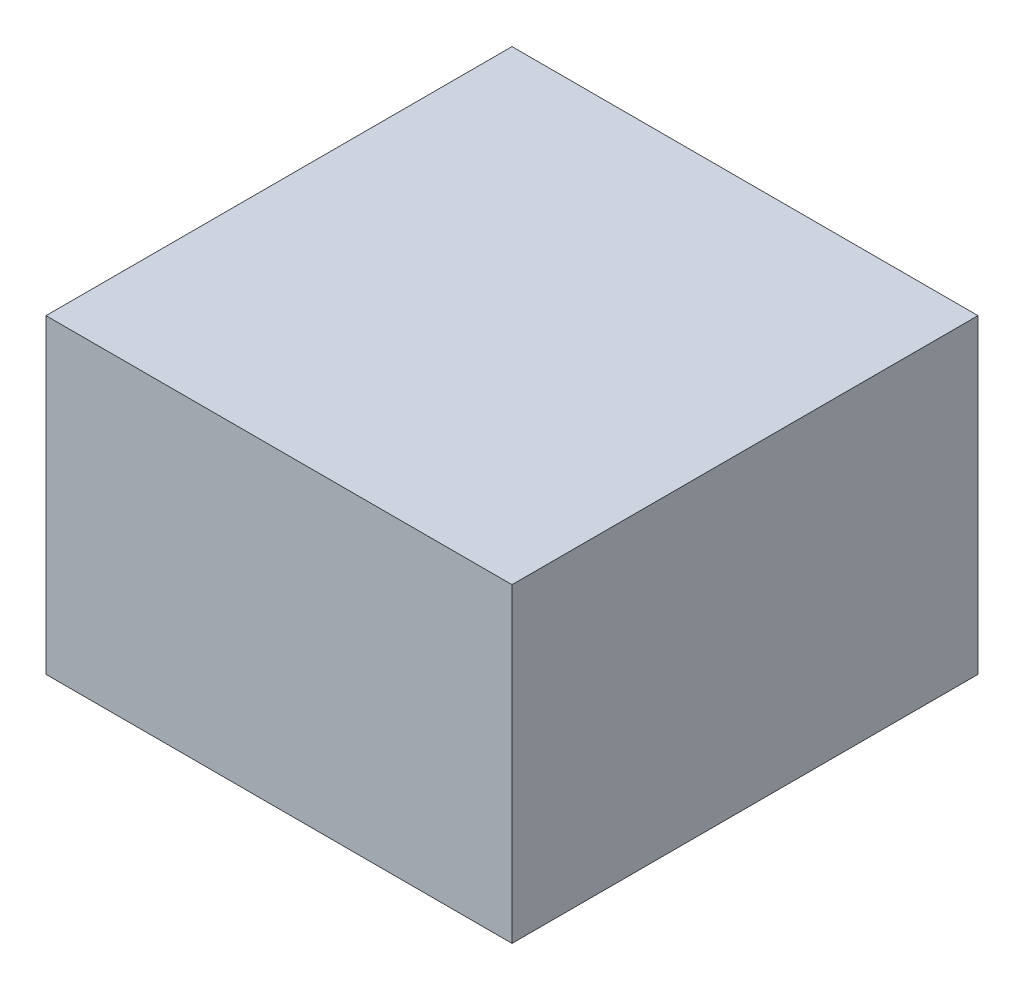
ISO-10303-21;
HEADER;
FILE_DESCRIPTION(('STEP AP214'),'2;1');
FILE_NAME('part.step','',(''),(''),'','','');
FILE_SCHEMA(('AUTOMOTIVE_DESIGN { 1 0 10303 214 1 1 1 1 }'));
ENDSEC;
DATA;
#1=APPLICATION_CONTEXT('core data for automotive mechanical design processes');
#2=APPLICATION_PROTOCOL_DEFINITION('international standard','automotive_design',2000,#1);
#3=PRODUCT_CONTEXT('',#1,'mechanical');
#4=PRODUCT('Part','Part','',(#3));
#5=PRODUCT_RELATED_PRODUCT_CATEGORY('part','',(#4));
#6=PRODUCT_DEFINITION_FORMATION('','',#4);
#7=PRODUCT_DEFINITION_CONTEXT('part definition',#1,'design');
#8=PRODUCT_DEFINITION('design','',#6,#7);
#9=PRODUCT_DEFINITION_SHAPE('','',#8);
#10=(LENGTH_UNIT() NAMED_UNIT(*) SI_UNIT(.MILLI.,.METRE.));
#11=(NAMED_UNIT(*) PLANE_ANGLE_UNIT() SI_UNIT($,.RADIAN.));
#12=(NAMED_UNIT(*) SI_UNIT($,.STERADIAN.) SOLID_ANGLE_UNIT());
#13=UNCERTAINTY_MEASURE_WITH_UNIT(LENGTH_MEASURE(1.E-05),#10,'distance_accuracy_value','');
#14=(GEOMETRIC_REPRESENTATION_CONTEXT(3) GLOBAL_UNCERTAINTY_ASSIGNED_CONTEXT((#13)) GLOBAL_UNIT_ASSIGNED_CONTEXT((#10,
#11,#12)) REPRESENTATION_CONTEXT('',''));
#15=CARTESIAN_POINT('',(0.,0.,0.));
#16=DIRECTION('',(0.,0.,1.));
#17=DIRECTION('',(1.,0.,0.));
#18=AXIS2_PLACEMENT_3D('',#15,#16,#17);
#19=CARTESIAN_POINT('',(0.,0.,30.));
#20=DIRECTION('',(-1.,0.,0.));
#21=DIRECTION('',(0.,0.,1.));
#22=AXIS2_PLACEMENT_3D('',#19,#20,#21);
#23=PLANE('',#22);
#24=DIRECTION('',(0.,1.,0.));
#25=VECTOR('',#24,1.);
#26=CARTESIAN_POINT('',(0.,0.,0.));
#27=LINE('',#26,#25);
#28=CARTESIAN_POINT('',(0.,0.,0.));
#29=VERTEX_POINT('',#28);
#30=CARTESIAN_POINT('',(0.,20.,0.));
#31=VERTEX_POINT('',#30);
#32=EDGE_CURVE('E96',#29,#31,#27,.T.);
#33=ORIENTED_EDGE('',*,*,#32,.T.);
#34=DIRECTION('',(0.,0.,-1.));
#35=VECTOR('',#34,1.);
#36=CARTESIAN_POINT('',(0.,20.,30.));
#37=LINE('',#36,#35);
#38=CARTESIAN_POINT('',(0.,20.,30.));
#39=VERTEX_POINT('',#38);
#40=EDGE_CURVE('E11',#39,#31,#37,.T.);
#41=ORIENTED_EDGE('',*,*,#40,.F.);
#42=DIRECTION('',(0.,1.,0.));
#43=VECTOR('',#42,1.);
#44=CARTESIAN_POINT('',(0.,0.,30.));
#45=LINE('',#44,#43);
#46=CARTESIAN_POINT('',(0.,0.,30.));
#47=VERTEX_POINT('',#46);
#48=EDGE_CURVE('E84',#47,#39,#45,.T.);
#49=ORIENTED_EDGE('',*,*,#48,.F.);
#50=DIRECTION('',(0.,0.,-1.));
#51=VECTOR('',#50,1.);
#52=CARTESIAN_POINT('',(0.,0.,30.));
#53=LINE('',#52,#51);
#54=EDGE_CURVE('E92',#47,#29,#53,.T.);
#55=ORIENTED_EDGE('',*,*,#54,.T.);
#56=EDGE_LOOP('',(#33,#41,#49,#55));
#57=FACE_BOUND('',#56,.T.);
#58=ADVANCED_FACE('F33',(#57),#23,.F.);
#59=CARTESIAN_POINT('',(0.,20.,30.));
#60=DIRECTION('',(0.,-1.,0.));
#61=DIRECTION('',(1.,0.,0.));
#62=AXIS2_PLACEMENT_3D('',#59,#60,#61);
#63=PLANE('',#62);
#64=DIRECTION('',(-1.,0.,0.));
#65=VECTOR('',#64,1.);
#66=CARTESIAN_POINT('',(0.,20.,0.));
#67=LINE('',#66,#65);
#68=CARTESIAN_POINT('',(-30.,20.,0.));
#69=VERTEX_POINT('',#68);
#70=EDGE_CURVE('E88',#31,#69,#67,.T.);
#71=ORIENTED_EDGE('',*,*,#70,.T.);
#72=DIRECTION('',(0.,0.,-1.));
#73=VECTOR('',#72,1.);
#74=CARTESIAN_POINT('',(-30.,20.,30.));
#75=LINE('',#74,#73);
#76=CARTESIAN_POINT('',(-30.,20.,30.));
#77=VERTEX_POINT('',#76);
#78=EDGE_CURVE('E41',#77,#69,#75,.T.);
#79=ORIENTED_EDGE('',*,*,#78,.F.);
#80=DIRECTION('',(-1.,0.,0.));
#81=VECTOR('',#80,1.);
#82=CARTESIAN_POINT('',(0.,20.,30.));
#83=LINE('',#82,#81);
#84=EDGE_CURVE('E79',#39,#77,#83,.T.);
#85=ORIENTED_EDGE('',*,*,#84,.F.);
#86=ORIENTED_EDGE('',*,*,#40,.T.);
#87=EDGE_LOOP('',(#71,#79,#85,#86));
#88=FACE_BOUND('',#87,.T.);
#89=ADVANCED_FACE('F87',(#88),#63,.F.);
#90=CARTESIAN_POINT('',(-30.,0.,30.));
#91=DIRECTION('',(1.,0.,0.));
#92=DIRECTION('',(0.,0.,-1.));
#93=AXIS2_PLACEMENT_3D('',#90,#91,#92);
#94=PLANE('',#93);
#95=DIRECTION('',(0.,-1.,0.));
#96=VECTOR('',#95,1.);
#97=CARTESIAN_POINT('',(-30.,0.,0.));
#98=LINE('',#97,#96);
#99=CARTESIAN_POINT('',(-30.,0.,0.));
#100=VERTEX_POINT('',#99);
#101=EDGE_CURVE('E66',#69,#100,#98,.T.);
#102=ORIENTED_EDGE('',*,*,#101,.T.);
#103=DIRECTION('',(0.,0.,-1.));
#104=VECTOR('',#103,1.);
#105=CARTESIAN_POINT('',(-30.,0.,30.));
#106=LINE('',#105,#104);
#107=CARTESIAN_POINT('',(-30.,0.,30.));
#108=VERTEX_POINT('',#107);
#109=EDGE_CURVE('E89',#108,#100,#106,.T.);
#110=ORIENTED_EDGE('',*,*,#109,.F.);
#111=DIRECTION('',(0.,-1.,0.));
#112=VECTOR('',#111,1.);
#113=CARTESIAN_POINT('',(-30.,0.,30.));
#114=LINE('',#113,#112);
#115=EDGE_CURVE('E82',#77,#108,#114,.T.);
#116=ORIENTED_EDGE('',*,*,#115,.F.);
#117=ORIENTED_EDGE('',*,*,#78,.T.);
#118=EDGE_LOOP('',(#102,#110,#116,#117));
#119=FACE_BOUND('',#118,.T.);
#120=ADVANCED_FACE('F90',(#119),#94,.F.);
#121=CARTESIAN_POINT('',(0.,0.,30.));
#122=DIRECTION('',(0.,1.,0.));
#123=DIRECTION('',(-1.,0.,0.));
#124=AXIS2_PLACEMENT_3D('',#121,#122,#123);
#125=PLANE('',#124);
#126=CARTESIAN_POINT('',(-20.,0.,10.));
#127=DIRECTION('',(0.,1.,0.));
#128=DIRECTION('',(0.,0.,1.));
#129=AXIS2_PLACEMENT_3D('',#126,#127,#128);
#130=CIRCLE('',#129,5.);
#131=CARTESIAN_POINT('',(-20.,0.,15.));
#132=VERTEX_POINT('',#131);
#133=EDGE_CURVE('E110',#132,#132,#130,.T.);
#134=ORIENTED_EDGE('',*,*,#133,.T.);
#135=EDGE_LOOP('',(#134));
#136=FACE_BOUND('',#135,.T.);
#137=DIRECTION('',(1.,0.,0.));
#138=VECTOR('',#137,1.);
#139=CARTESIAN_POINT('',(0.,0.,0.));
#140=LINE('',#139,#138);
#141=EDGE_CURVE('E72',#100,#29,#140,.T.);
#142=ORIENTED_EDGE('',*,*,#141,.T.);
#143=ORIENTED_EDGE('',*,*,#54,.F.);
#144=DIRECTION('',(1.,0.,0.));
#145=VECTOR('',#144,1.);
#146=CARTESIAN_POINT('',(0.,0.,30.));
#147=LINE('',#146,#145);
#148=EDGE_CURVE('E49',#108,#47,#147,.T.);
#149=ORIENTED_EDGE('',*,*,#148,.F.);
#150=ORIENTED_EDGE('',*,*,#109,.T.);
#151=EDGE_LOOP('',(#142,#143,#149,#150));
#152=FACE_BOUND('',#151,.T.);
#153=ADVANCED_FACE('F104',(#136,#152),#125,.F.);
#154=CARTESIAN_POINT('',(0.,0.,30.));
#155=DIRECTION('',(0.,0.,1.));
#156=DIRECTION('',(1.,0.,0.));
#157=AXIS2_PLACEMENT_3D('',#154,#155,#156);
#158=PLANE('',#157);
#159=ORIENTED_EDGE('',*,*,#48,.T.);
#160=ORIENTED_EDGE('',*,*,#84,.T.);
#161=ORIENTED_EDGE('',*,*,#115,.T.);
#162=ORIENTED_EDGE('',*,*,#148,.T.);
#163=EDGE_LOOP('',(#159,#160,#161,#162));
#164=FACE_BOUND('',#163,.T.);
#165=ADVANCED_FACE('F80',(#164),#158,.T.);
#166=CARTESIAN_POINT('',(0.,0.,0.));
#167=DIRECTION('',(0.,0.,1.));
#168=DIRECTION('',(1.,0.,0.));
#169=AXIS2_PLACEMENT_3D('',#166,#167,#168);
#170=PLANE('',#169);
#171=ORIENTED_EDGE('',*,*,#32,.F.);
#172=ORIENTED_EDGE('',*,*,#141,.F.);
#173=ORIENTED_EDGE('',*,*,#101,.F.);
#174=ORIENTED_EDGE('',*,*,#70,.F.);
#175=EDGE_LOOP('',(#171,#172,#173,#174));
#176=FACE_BOUND('',#175,.T.);
#177=ADVANCED_FACE('F107',(#176),#170,.F.);
#178=CARTESIAN_POINT('',(-20.,-10.,10.));
#179=DIRECTION('',(0.,1.,0.));
#180=DIRECTION('',(0.,0.,1.));
#181=AXIS2_PLACEMENT_3D('',#178,#179,#180);
#182=CYLINDRICAL_SURFACE('',#181,5.);
#183=CARTESIAN_POINT('',(-20.,-10.,10.));
#184=DIRECTION('',(0.,1.,0.));
#185=DIRECTION('',(0.,0.,1.));
#186=AXIS2_PLACEMENT_3D('',#183,#184,#185);
#187=CIRCLE('',#186,5.);
#188=CARTESIAN_POINT('',(-20.,-10.,15.));
#189=VERTEX_POINT('',#188);
#190=EDGE_CURVE('E99',#189,#189,#187,.T.);
#191=ORIENTED_EDGE('',*,*,#190,.T.);
#192=EDGE_LOOP('',(#191));
#193=FACE_BOUND('',#192,.T.);
#194=ORIENTED_EDGE('',*,*,#133,.F.);
#195=EDGE_LOOP('',(#194));
#196=FACE_BOUND('',#195,.T.);
#197=ADVANCED_FACE('F116',(#193,#196),#182,.T.);
#198=CARTESIAN_POINT('',(-20.,-10.,10.));
#199=DIRECTION('',(0.,1.,0.));
#200=DIRECTION('',(0.,0.,1.));
#201=AXIS2_PLACEMENT_3D('',#198,#199,#200);
#202=PLANE('',#201);
#203=ORIENTED_EDGE('',*,*,#190,.F.);
#204=EDGE_LOOP('',(#203));
#205=FACE_BOUND('',#204,.T.);
#206=ADVANCED_FACE('F119',(#205),#202,.F.);
#207=CLOSED_SHELL('',(#58,#89,#120,#153,#165,#177,#197,#206));
#208=MANIFOLD_SOLID_BREP('B2',#207);
#209=ADVANCED_BREP_SHAPE_REPRESENTATION('',(#18,#208),#14);
#210=SHAPE_DEFINITION_REPRESENTATION(#9,#209);
ENDSEC;
END-ISO-10303-21;
